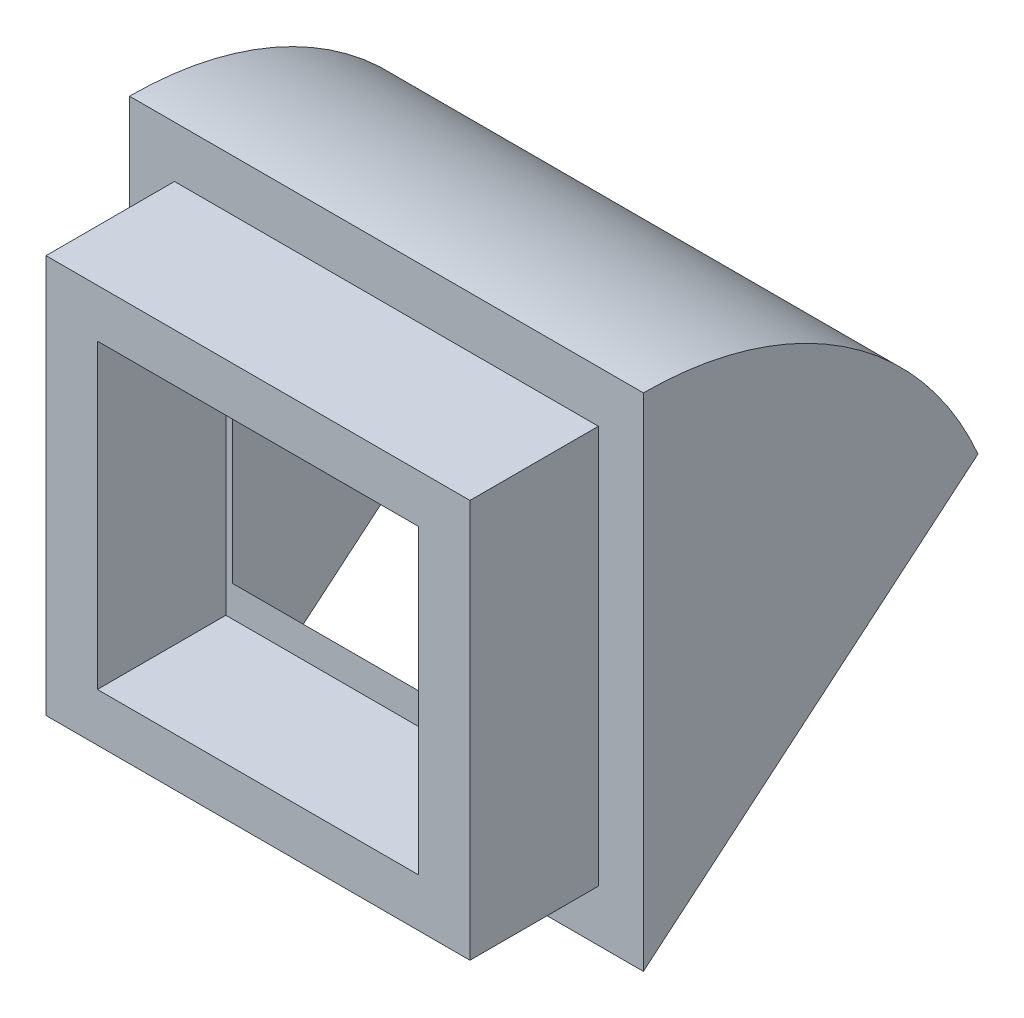
ISO-10303-21;
HEADER;
FILE_DESCRIPTION(('STEP AP214'),'2;1');
FILE_NAME('part.step','',(''),(''),'','','');
FILE_SCHEMA(('AUTOMOTIVE_DESIGN { 1 0 10303 214 1 1 1 1 }'));
ENDSEC;
DATA;
#1=APPLICATION_CONTEXT('core data for automotive mechanical design processes');
#2=APPLICATION_PROTOCOL_DEFINITION('international standard','automotive_design',2000,#1);
#3=PRODUCT_CONTEXT('',#1,'mechanical');
#4=PRODUCT('Part','Part','',(#3));
#5=PRODUCT_RELATED_PRODUCT_CATEGORY('part','',(#4));
#6=PRODUCT_DEFINITION_FORMATION('','',#4);
#7=PRODUCT_DEFINITION_CONTEXT('part definition',#1,'design');
#8=PRODUCT_DEFINITION('design','',#6,#7);
#9=PRODUCT_DEFINITION_SHAPE('','',#8);
#10=(LENGTH_UNIT() NAMED_UNIT(*) SI_UNIT(.MILLI.,.METRE.));
#11=(NAMED_UNIT(*) PLANE_ANGLE_UNIT() SI_UNIT($,.RADIAN.));
#12=(NAMED_UNIT(*) SI_UNIT($,.STERADIAN.) SOLID_ANGLE_UNIT());
#13=UNCERTAINTY_MEASURE_WITH_UNIT(LENGTH_MEASURE(1.E-05),#10,'distance_accuracy_value','');
#14=(GEOMETRIC_REPRESENTATION_CONTEXT(3) GLOBAL_UNCERTAINTY_ASSIGNED_CONTEXT((#13)) GLOBAL_UNIT_ASSIGNED_CONTEXT((#10,
#11,#12)) REPRESENTATION_CONTEXT('',''));
#15=CARTESIAN_POINT('',(0.,0.,0.));
#16=DIRECTION('',(0.,0.,1.));
#17=DIRECTION('',(1.,0.,0.));
#18=AXIS2_PLACEMENT_3D('',#15,#16,#17);
#19=CARTESIAN_POINT('',(10.,1.17738936467124,-13.0227555330226));
#20=DIRECTION('',(0.,0.766044443118975,0.642787609686544));
#21=DIRECTION('',(0.,-0.642787609686544,0.766044443118975));
#22=AXIS2_PLACEMENT_3D('',#19,#20,#21);
#23=PLANE('',#22);
#24=DIRECTION('',(0.,0.642787609686544,-0.766044443118975));
#25=VECTOR('',#24,1.);
#26=CARTESIAN_POINT('',(-10.,1.17738936467124,-13.0227555330226));
#27=LINE('',#26,#25);
#28=CARTESIAN_POINT('',(-10.,-9.75,0.));
#29=VERTEX_POINT('',#28);
#30=CARTESIAN_POINT('',(-10.,1.17738936467124,-13.0227555330226));
#31=VERTEX_POINT('',#30);
#32=EDGE_CURVE('E191',#29,#31,#27,.T.);
#33=ORIENTED_EDGE('',*,*,#32,.T.);
#34=DIRECTION('',(-1.,0.,0.));
#35=VECTOR('',#34,1.);
#36=CARTESIAN_POINT('',(10.,1.17738936467124,-13.0227555330226));
#37=LINE('',#36,#35);
#38=CARTESIAN_POINT('',(10.,1.17738936467124,-13.0227555330226));
#39=VERTEX_POINT('',#38);
#40=EDGE_CURVE('E197',#39,#31,#37,.T.);
#41=ORIENTED_EDGE('',*,*,#40,.F.);
#42=DIRECTION('',(0.,0.642787609686544,-0.766044443118975));
#43=VECTOR('',#42,1.);
#44=CARTESIAN_POINT('',(10.,1.17738936467124,-13.0227555330226));
#45=LINE('',#44,#43);
#46=CARTESIAN_POINT('',(10.,-9.75,0.));
#47=VERTEX_POINT('',#46);
#48=EDGE_CURVE('E194',#47,#39,#45,.T.);
#49=ORIENTED_EDGE('',*,*,#48,.F.);
#50=DIRECTION('',(-1.,0.,0.));
#51=VECTOR('',#50,1.);
#52=CARTESIAN_POINT('',(10.,-9.75,0.));
#53=LINE('',#52,#51);
#54=EDGE_CURVE('E211',#47,#29,#53,.T.);
#55=ORIENTED_EDGE('',*,*,#54,.T.);
#56=EDGE_LOOP('',(#33,#41,#49,#55));
#57=FACE_BOUND('',#56,.T.);
#58=DIRECTION('',(0.,-0.642787609686544,0.766044443118975));
#59=VECTOR('',#58,1.);
#60=CARTESIAN_POINT('',(-6.,-7.64989769518585,-2.50280446657761));
#61=LINE('',#60,#59);
#62=CARTESIAN_POINT('',(-6.,-3.79317203706659,-7.09907112529146));
#63=VERTEX_POINT('',#62);
#64=CARTESIAN_POINT('',(-6.,-7.64989769518585,-2.50280446657761));
#65=VERTEX_POINT('',#64);
#66=EDGE_CURVE('E146',#63,#65,#61,.T.);
#67=ORIENTED_EDGE('',*,*,#66,.T.);
#68=DIRECTION('',(1.,0.,0.));
#69=VECTOR('',#68,1.);
#70=CARTESIAN_POINT('',(-6.,-7.64989769518585,-2.50280446657761));
#71=LINE('',#70,#69);
#72=CARTESIAN_POINT('',(6.,-7.64989769518586,-2.50280446657761));
#73=VERTEX_POINT('',#72);
#74=EDGE_CURVE('E172',#65,#73,#71,.T.);
#75=ORIENTED_EDGE('',*,*,#74,.T.);
#76=DIRECTION('',(0.,0.642787609686544,-0.766044443118975));
#77=VECTOR('',#76,1.);
#78=CARTESIAN_POINT('',(6.,-7.64989769518585,-2.50280446657761));
#79=LINE('',#78,#77);
#80=CARTESIAN_POINT('',(6.,-3.79317203706659,-7.09907112529146));
#81=VERTEX_POINT('',#80);
#82=EDGE_CURVE('E168',#73,#81,#79,.T.);
#83=ORIENTED_EDGE('',*,*,#82,.T.);
#84=DIRECTION('',(-1.,0.,0.));
#85=VECTOR('',#84,1.);
#86=CARTESIAN_POINT('',(-6.,-3.79317203706659,-7.09907112529146));
#87=LINE('',#86,#85);
#88=EDGE_CURVE('E156',#81,#63,#87,.T.);
#89=ORIENTED_EDGE('',*,*,#88,.T.);
#90=EDGE_LOOP('',(#67,#75,#83,#89));
#91=FACE_BOUND('',#90,.T.);
#92=ADVANCED_FACE('F39',(#57,#91),#23,.F.);
#93=CARTESIAN_POINT('',(0.,0.,5.));
#94=DIRECTION('',(0.,0.,1.));
#95=DIRECTION('',(1.,0.,0.));
#96=AXIS2_PLACEMENT_3D('',#93,#94,#95);
#97=PLANE('',#96);
#98=DIRECTION('',(0.,1.,0.));
#99=VECTOR('',#98,1.);
#100=CARTESIAN_POINT('',(8.25,7.75,5.));
#101=LINE('',#100,#99);
#102=CARTESIAN_POINT('',(8.25,-7.75,5.));
#103=VERTEX_POINT('',#102);
#104=CARTESIAN_POINT('',(8.25,7.75,5.));
#105=VERTEX_POINT('',#104);
#106=EDGE_CURVE('E262',#103,#105,#101,.T.);
#107=ORIENTED_EDGE('',*,*,#106,.T.);
#108=DIRECTION('',(-1.,0.,0.));
#109=VECTOR('',#108,1.);
#110=CARTESIAN_POINT('',(-8.25,7.75,5.));
#111=LINE('',#110,#109);
#112=CARTESIAN_POINT('',(-8.25,7.75,5.));
#113=VERTEX_POINT('',#112);
#114=EDGE_CURVE('E266',#105,#113,#111,.T.);
#115=ORIENTED_EDGE('',*,*,#114,.T.);
#116=DIRECTION('',(0.,-1.,0.));
#117=VECTOR('',#116,1.);
#118=CARTESIAN_POINT('',(-8.25,7.75,5.));
#119=LINE('',#118,#117);
#120=CARTESIAN_POINT('',(-8.25,-7.75,5.));
#121=VERTEX_POINT('',#120);
#122=EDGE_CURVE('E270',#113,#121,#119,.T.);
#123=ORIENTED_EDGE('',*,*,#122,.T.);
#124=DIRECTION('',(1.,0.,0.));
#125=VECTOR('',#124,1.);
#126=CARTESIAN_POINT('',(-8.25,-7.75,5.));
#127=LINE('',#126,#125);
#128=EDGE_CURVE('E273',#121,#103,#127,.T.);
#129=ORIENTED_EDGE('',*,*,#128,.T.);
#130=EDGE_LOOP('',(#107,#115,#123,#129));
#131=FACE_BOUND('',#130,.T.);
#132=DIRECTION('',(-1.,0.,0.));
#133=VECTOR('',#132,1.);
#134=CARTESIAN_POINT('',(-6.25,5.87121212121212,5.));
#135=LINE('',#134,#133);
#136=CARTESIAN_POINT('',(6.25,5.87121212121212,5.));
#137=VERTEX_POINT('',#136);
#138=CARTESIAN_POINT('',(-6.25,5.87121212121212,5.));
#139=VERTEX_POINT('',#138);
#140=EDGE_CURVE('E223',#137,#139,#135,.T.);
#141=ORIENTED_EDGE('',*,*,#140,.F.);
#142=DIRECTION('',(0.,1.,0.));
#143=VECTOR('',#142,1.);
#144=CARTESIAN_POINT('',(6.25,5.87121212121212,5.));
#145=LINE('',#144,#143);
#146=CARTESIAN_POINT('',(6.25,-5.87121212121213,5.));
#147=VERTEX_POINT('',#146);
#148=EDGE_CURVE('E220',#147,#137,#145,.T.);
#149=ORIENTED_EDGE('',*,*,#148,.F.);
#150=DIRECTION('',(1.,0.,0.));
#151=VECTOR('',#150,1.);
#152=CARTESIAN_POINT('',(-6.25,-5.87121212121213,5.));
#153=LINE('',#152,#151);
#154=CARTESIAN_POINT('',(-6.25,-5.87121212121213,5.));
#155=VERTEX_POINT('',#154);
#156=EDGE_CURVE('E231',#155,#147,#153,.T.);
#157=ORIENTED_EDGE('',*,*,#156,.F.);
#158=DIRECTION('',(0.,-1.,0.));
#159=VECTOR('',#158,1.);
#160=CARTESIAN_POINT('',(-6.25,5.87121212121212,5.));
#161=LINE('',#160,#159);
#162=EDGE_CURVE('E227',#139,#155,#161,.T.);
#163=ORIENTED_EDGE('',*,*,#162,.F.);
#164=EDGE_LOOP('',(#141,#149,#157,#163));
#165=FACE_BOUND('',#164,.T.);
#166=ADVANCED_FACE('F317',(#131,#165),#97,.T.);
#167=CARTESIAN_POINT('',(8.25,7.75,5.));
#168=DIRECTION('',(-1.,0.,0.));
#169=DIRECTION('',(0.,-1.,0.));
#170=AXIS2_PLACEMENT_3D('',#167,#168,#169);
#171=PLANE('',#170);
#172=DIRECTION('',(0.,1.,0.));
#173=VECTOR('',#172,1.);
#174=CARTESIAN_POINT('',(8.25,7.75,0.));
#175=LINE('',#174,#173);
#176=CARTESIAN_POINT('',(8.25,-7.75,0.));
#177=VERTEX_POINT('',#176);
#178=CARTESIAN_POINT('',(8.25,7.75,0.));
#179=VERTEX_POINT('',#178);
#180=EDGE_CURVE('E261',#177,#179,#175,.T.);
#181=ORIENTED_EDGE('',*,*,#180,.T.);
#182=DIRECTION('',(0.,0.,-1.));
#183=VECTOR('',#182,1.);
#184=CARTESIAN_POINT('',(8.25,7.75,5.));
#185=LINE('',#184,#183);
#186=EDGE_CURVE('E11',#105,#179,#185,.T.);
#187=ORIENTED_EDGE('',*,*,#186,.F.);
#188=ORIENTED_EDGE('',*,*,#106,.F.);
#189=DIRECTION('',(0.,0.,-1.));
#190=VECTOR('',#189,1.);
#191=CARTESIAN_POINT('',(8.25,-7.75,5.));
#192=LINE('',#191,#190);
#193=EDGE_CURVE('E276',#103,#177,#192,.T.);
#194=ORIENTED_EDGE('',*,*,#193,.T.);
#195=EDGE_LOOP('',(#181,#187,#188,#194));
#196=FACE_BOUND('',#195,.T.);
#197=ADVANCED_FACE('F41',(#196),#171,.F.);
#198=CARTESIAN_POINT('',(-8.25,7.75,5.));
#199=DIRECTION('',(0.,-1.,0.));
#200=DIRECTION('',(0.,0.,-1.));
#201=AXIS2_PLACEMENT_3D('',#198,#199,#200);
#202=PLANE('',#201);
#203=DIRECTION('',(-1.,0.,0.));
#204=VECTOR('',#203,1.);
#205=CARTESIAN_POINT('',(-8.25,7.75,0.));
#206=LINE('',#205,#204);
#207=CARTESIAN_POINT('',(-8.25,7.75,0.));
#208=VERTEX_POINT('',#207);
#209=EDGE_CURVE('E280',#179,#208,#206,.T.);
#210=ORIENTED_EDGE('',*,*,#209,.T.);
#211=DIRECTION('',(0.,0.,-1.));
#212=VECTOR('',#211,1.);
#213=CARTESIAN_POINT('',(-8.25,7.75,5.));
#214=LINE('',#213,#212);
#215=EDGE_CURVE('E48',#113,#208,#214,.T.);
#216=ORIENTED_EDGE('',*,*,#215,.F.);
#217=ORIENTED_EDGE('',*,*,#114,.F.);
#218=ORIENTED_EDGE('',*,*,#186,.T.);
#219=EDGE_LOOP('',(#210,#216,#217,#218));
#220=FACE_BOUND('',#219,.T.);
#221=ADVANCED_FACE('F305',(#220),#202,.F.);
#222=CARTESIAN_POINT('',(-8.25,7.75,5.));
#223=DIRECTION('',(1.,0.,0.));
#224=DIRECTION('',(0.,1.,0.));
#225=AXIS2_PLACEMENT_3D('',#222,#223,#224);
#226=PLANE('',#225);
#227=DIRECTION('',(0.,-1.,0.));
#228=VECTOR('',#227,1.);
#229=CARTESIAN_POINT('',(-8.25,7.75,0.));
#230=LINE('',#229,#228);
#231=CARTESIAN_POINT('',(-8.25,-7.75,0.));
#232=VERTEX_POINT('',#231);
#233=EDGE_CURVE('E284',#208,#232,#230,.T.);
#234=ORIENTED_EDGE('',*,*,#233,.T.);
#235=DIRECTION('',(0.,0.,-1.));
#236=VECTOR('',#235,1.);
#237=CARTESIAN_POINT('',(-8.25,-7.75,5.));
#238=LINE('',#237,#236);
#239=EDGE_CURVE('E294',#121,#232,#238,.T.);
#240=ORIENTED_EDGE('',*,*,#239,.F.);
#241=ORIENTED_EDGE('',*,*,#122,.F.);
#242=ORIENTED_EDGE('',*,*,#215,.T.);
#243=EDGE_LOOP('',(#234,#240,#241,#242));
#244=FACE_BOUND('',#243,.T.);
#245=ADVANCED_FACE('F302',(#244),#226,.F.);
#246=CARTESIAN_POINT('',(-8.25,-7.75,5.));
#247=DIRECTION('',(0.,1.,0.));
#248=DIRECTION('',(0.,0.,1.));
#249=AXIS2_PLACEMENT_3D('',#246,#247,#248);
#250=PLANE('',#249);
#251=DIRECTION('',(1.,0.,0.));
#252=VECTOR('',#251,1.);
#253=CARTESIAN_POINT('',(-8.25,-7.75,0.));
#254=LINE('',#253,#252);
#255=EDGE_CURVE('E267',#232,#177,#254,.T.);
#256=ORIENTED_EDGE('',*,*,#255,.T.);
#257=ORIENTED_EDGE('',*,*,#193,.F.);
#258=ORIENTED_EDGE('',*,*,#128,.F.);
#259=ORIENTED_EDGE('',*,*,#239,.T.);
#260=EDGE_LOOP('',(#256,#257,#258,#259));
#261=FACE_BOUND('',#260,.T.);
#262=ADVANCED_FACE('F312',(#261),#250,.F.);
#263=CARTESIAN_POINT('',(6.25,5.87121212121212,5.));
#264=DIRECTION('',(-1.,0.,0.));
#265=DIRECTION('',(0.,0.,1.));
#266=AXIS2_PLACEMENT_3D('',#263,#264,#265);
#267=PLANE('',#266);
#268=DIRECTION('',(0.,1.,0.));
#269=VECTOR('',#268,1.);
#270=CARTESIAN_POINT('',(6.25,5.87121212121212,0.));
#271=LINE('',#270,#269);
#272=CARTESIAN_POINT('',(6.25,-5.87121212121213,0.));
#273=VERTEX_POINT('',#272);
#274=CARTESIAN_POINT('',(6.25,5.87121212121212,0.));
#275=VERTEX_POINT('',#274);
#276=EDGE_CURVE('E219',#273,#275,#271,.T.);
#277=ORIENTED_EDGE('',*,*,#276,.F.);
#278=DIRECTION('',(0.,0.,-1.));
#279=VECTOR('',#278,1.);
#280=CARTESIAN_POINT('',(6.25,-5.87121212121213,5.));
#281=LINE('',#280,#279);
#282=EDGE_CURVE('E234',#147,#273,#281,.T.);
#283=ORIENTED_EDGE('',*,*,#282,.F.);
#284=ORIENTED_EDGE('',*,*,#148,.T.);
#285=DIRECTION('',(0.,0.,-1.));
#286=VECTOR('',#285,1.);
#287=CARTESIAN_POINT('',(6.25,5.87121212121212,5.));
#288=LINE('',#287,#286);
#289=EDGE_CURVE('E257',#137,#275,#288,.T.);
#290=ORIENTED_EDGE('',*,*,#289,.T.);
#291=EDGE_LOOP('',(#277,#283,#284,#290));
#292=FACE_BOUND('',#291,.T.);
#293=ADVANCED_FACE('F337',(#292),#267,.T.);
#294=CARTESIAN_POINT('',(-6.25,5.87121212121212,5.));
#295=DIRECTION('',(0.,-1.,0.));
#296=DIRECTION('',(0.,0.,-1.));
#297=AXIS2_PLACEMENT_3D('',#294,#295,#296);
#298=PLANE('',#297);
#299=DIRECTION('',(-1.,0.,0.));
#300=VECTOR('',#299,1.);
#301=CARTESIAN_POINT('',(-6.25,5.87121212121212,0.));
#302=LINE('',#301,#300);
#303=CARTESIAN_POINT('',(-6.25,5.87121212121212,0.));
#304=VERTEX_POINT('',#303);
#305=EDGE_CURVE('E238',#275,#304,#302,.T.);
#306=ORIENTED_EDGE('',*,*,#305,.F.);
#307=ORIENTED_EDGE('',*,*,#289,.F.);
#308=ORIENTED_EDGE('',*,*,#140,.T.);
#309=DIRECTION('',(0.,0.,-1.));
#310=VECTOR('',#309,1.);
#311=CARTESIAN_POINT('',(-6.25,5.87121212121212,5.));
#312=LINE('',#311,#310);
#313=EDGE_CURVE('E254',#139,#304,#312,.T.);
#314=ORIENTED_EDGE('',*,*,#313,.T.);
#315=EDGE_LOOP('',(#306,#307,#308,#314));
#316=FACE_BOUND('',#315,.T.);
#317=ADVANCED_FACE('F328',(#316),#298,.T.);
#318=CARTESIAN_POINT('',(-6.25,5.87121212121212,5.));
#319=DIRECTION('',(1.,0.,0.));
#320=DIRECTION('',(0.,0.,-1.));
#321=AXIS2_PLACEMENT_3D('',#318,#319,#320);
#322=PLANE('',#321);
#323=DIRECTION('',(0.,-1.,0.));
#324=VECTOR('',#323,1.);
#325=CARTESIAN_POINT('',(-6.25,5.87121212121212,0.));
#326=LINE('',#325,#324);
#327=CARTESIAN_POINT('',(-6.25,-5.87121212121213,0.));
#328=VERTEX_POINT('',#327);
#329=EDGE_CURVE('E242',#304,#328,#326,.T.);
#330=ORIENTED_EDGE('',*,*,#329,.F.);
#331=ORIENTED_EDGE('',*,*,#313,.F.);
#332=ORIENTED_EDGE('',*,*,#162,.T.);
#333=DIRECTION('',(0.,0.,-1.));
#334=VECTOR('',#333,1.);
#335=CARTESIAN_POINT('',(-6.25,-5.87121212121213,5.));
#336=LINE('',#335,#334);
#337=EDGE_CURVE('E251',#155,#328,#336,.T.);
#338=ORIENTED_EDGE('',*,*,#337,.T.);
#339=EDGE_LOOP('',(#330,#331,#332,#338));
#340=FACE_BOUND('',#339,.T.);
#341=ADVANCED_FACE('F331',(#340),#322,.T.);
#342=CARTESIAN_POINT('',(-6.25,-5.87121212121213,5.));
#343=DIRECTION('',(0.,1.,0.));
#344=DIRECTION('',(0.,0.,1.));
#345=AXIS2_PLACEMENT_3D('',#342,#343,#344);
#346=PLANE('',#345);
#347=DIRECTION('',(1.,0.,0.));
#348=VECTOR('',#347,1.);
#349=CARTESIAN_POINT('',(-6.25,-5.87121212121213,0.));
#350=LINE('',#349,#348);
#351=EDGE_CURVE('E224',#328,#273,#350,.T.);
#352=ORIENTED_EDGE('',*,*,#351,.F.);
#353=ORIENTED_EDGE('',*,*,#337,.F.);
#354=ORIENTED_EDGE('',*,*,#156,.T.);
#355=ORIENTED_EDGE('',*,*,#282,.T.);
#356=EDGE_LOOP('',(#352,#353,#354,#355));
#357=FACE_BOUND('',#356,.T.);
#358=ADVANCED_FACE('F340',(#357),#346,.T.);
#359=CARTESIAN_POINT('',(10.,-9.75,0.));
#360=DIRECTION('',(0.,0.,-1.));
#361=DIRECTION('',(-1.,0.,0.));
#362=AXIS2_PLACEMENT_3D('',#359,#360,#361);
#363=PLANE('',#362);
#364=DIRECTION('',(1.,0.,0.));
#365=VECTOR('',#364,1.);
#366=CARTESIAN_POINT('',(-6.,4.66717148058123,0.));
#367=LINE('',#366,#365);
#368=CARTESIAN_POINT('',(-6.,4.66717148058123,0.));
#369=VERTEX_POINT('',#368);
#370=CARTESIAN_POINT('',(6.,4.66717148058123,0.));
#371=VERTEX_POINT('',#370);
#372=EDGE_CURVE('E163',#369,#371,#367,.T.);
#373=ORIENTED_EDGE('',*,*,#372,.T.);
#374=DIRECTION('',(0.,-1.,0.));
#375=VECTOR('',#374,1.);
#376=CARTESIAN_POINT('',(6.,-8.41594213830483,0.));
#377=LINE('',#376,#375);
#378=CARTESIAN_POINT('',(6.,-4.66717148058118,0.));
#379=VERTEX_POINT('',#378);
#380=EDGE_CURVE('E507',#371,#379,#377,.T.);
#381=ORIENTED_EDGE('',*,*,#380,.T.);
#382=DIRECTION('',(-1.,0.,0.));
#383=VECTOR('',#382,1.);
#384=CARTESIAN_POINT('',(-6.,-4.66717148058118,0.));
#385=LINE('',#384,#383);
#386=CARTESIAN_POINT('',(-6.,-4.66717148058118,0.));
#387=VERTEX_POINT('',#386);
#388=EDGE_CURVE('E203',#379,#387,#385,.T.);
#389=ORIENTED_EDGE('',*,*,#388,.T.);
#390=DIRECTION('',(0.,1.,0.));
#391=VECTOR('',#390,1.);
#392=CARTESIAN_POINT('',(-6.,-8.41594213830483,0.));
#393=LINE('',#392,#391);
#394=EDGE_CURVE('E155',#387,#369,#393,.T.);
#395=ORIENTED_EDGE('',*,*,#394,.T.);
#396=EDGE_LOOP('',(#373,#381,#389,#395));
#397=FACE_BOUND('',#396,.T.);
#398=ORIENTED_EDGE('',*,*,#351,.T.);
#399=ORIENTED_EDGE('',*,*,#276,.T.);
#400=ORIENTED_EDGE('',*,*,#305,.T.);
#401=ORIENTED_EDGE('',*,*,#329,.T.);
#402=EDGE_LOOP('',(#398,#399,#400,#401));
#403=FACE_BOUND('',#402,.T.);
#404=ADVANCED_FACE('F334',(#397,#403),#363,.F.);
#405=CARTESIAN_POINT('',(10.,-4.43708897848889,0.0061033528761887));
#406=DIRECTION('',(-1.,0.,0.));
#407=DIRECTION('',(0.,0.,1.));
#408=AXIS2_PLACEMENT_3D('',#405,#406,#407);
#409=CYLINDRICAL_SURFACE('',#408,14.1870902913345);
#410=CARTESIAN_POINT('',(-10.,-4.43708897848889,0.0061033528761887));
#411=DIRECTION('',(1.,0.,0.));
#412=DIRECTION('',(0.,0.,1.));
#413=AXIS2_PLACEMENT_3D('',#410,#411,#412);
#414=CIRCLE('',#413,14.1870902913345);
#415=CARTESIAN_POINT('',(-10.,9.75,0.));
#416=VERTEX_POINT('',#415);
#417=EDGE_CURVE('E198',#31,#416,#414,.T.);
#418=ORIENTED_EDGE('',*,*,#417,.T.);
#419=DIRECTION('',(-1.,0.,0.));
#420=VECTOR('',#419,1.);
#421=CARTESIAN_POINT('',(10.,9.75,0.));
#422=LINE('',#421,#420);
#423=CARTESIAN_POINT('',(10.,9.75,0.));
#424=VERTEX_POINT('',#423);
#425=EDGE_CURVE('E215',#424,#416,#422,.T.);
#426=ORIENTED_EDGE('',*,*,#425,.F.);
#427=CARTESIAN_POINT('',(10.,-4.43708897848889,0.0061033528761887));
#428=DIRECTION('',(1.,0.,0.));
#429=DIRECTION('',(0.,0.,1.));
#430=AXIS2_PLACEMENT_3D('',#427,#428,#429);
#431=CIRCLE('',#430,14.1870902913345);
#432=EDGE_CURVE('E186',#39,#424,#431,.T.);
#433=ORIENTED_EDGE('',*,*,#432,.F.);
#434=ORIENTED_EDGE('',*,*,#40,.T.);
#435=EDGE_LOOP('',(#418,#426,#433,#434));
#436=FACE_BOUND('',#435,.T.);
#437=ADVANCED_FACE('F347',(#436),#409,.T.);
#438=ORIENTED_EDGE('',*,*,#180,.F.);
#439=ORIENTED_EDGE('',*,*,#255,.F.);
#440=ORIENTED_EDGE('',*,*,#233,.F.);
#441=ORIENTED_EDGE('',*,*,#209,.F.);
#442=EDGE_LOOP('',(#438,#439,#440,#441));
#443=FACE_BOUND('',#442,.T.);
#444=DIRECTION('',(0.,-1.,0.));
#445=VECTOR('',#444,1.);
#446=CARTESIAN_POINT('',(-10.,-9.75,0.));
#447=LINE('',#446,#445);
#448=EDGE_CURVE('E202',#416,#29,#447,.T.);
#449=ORIENTED_EDGE('',*,*,#448,.T.);
#450=ORIENTED_EDGE('',*,*,#54,.F.);
#451=DIRECTION('',(0.,-1.,0.));
#452=VECTOR('',#451,1.);
#453=CARTESIAN_POINT('',(10.,-9.75,0.));
#454=LINE('',#453,#452);
#455=EDGE_CURVE('E190',#424,#47,#454,.T.);
#456=ORIENTED_EDGE('',*,*,#455,.F.);
#457=ORIENTED_EDGE('',*,*,#425,.T.);
#458=EDGE_LOOP('',(#449,#450,#456,#457));
#459=FACE_BOUND('',#458,.T.);
#460=ADVANCED_FACE('F308',(#443,#459),#363,.F.);
#461=CARTESIAN_POINT('',(10.,-4.43708897848889,0.0061033528761887));
#462=DIRECTION('',(-1.,0.,0.));
#463=DIRECTION('',(0.,0.,1.));
#464=AXIS2_PLACEMENT_3D('',#461,#462,#463);
#465=PLANE('',#464);
#466=ORIENTED_EDGE('',*,*,#432,.T.);
#467=ORIENTED_EDGE('',*,*,#455,.T.);
#468=ORIENTED_EDGE('',*,*,#48,.T.);
#469=EDGE_LOOP('',(#466,#467,#468));
#470=FACE_BOUND('',#469,.T.);
#471=ADVANCED_FACE('F361',(#470),#465,.F.);
#472=CARTESIAN_POINT('',(-10.,-4.43708897848889,0.0061033528761887));
#473=DIRECTION('',(-1.,0.,0.));
#474=DIRECTION('',(0.,0.,1.));
#475=AXIS2_PLACEMENT_3D('',#472,#473,#474);
#476=PLANE('',#475);
#477=ORIENTED_EDGE('',*,*,#417,.F.);
#478=ORIENTED_EDGE('',*,*,#32,.F.);
#479=ORIENTED_EDGE('',*,*,#448,.F.);
#480=EDGE_LOOP('',(#477,#478,#479));
#481=FACE_BOUND('',#480,.T.);
#482=ADVANCED_FACE('F358',(#481),#476,.T.);
#483=CARTESIAN_POINT('',(-6.,-8.41594213830483,-3.14559207626416));
#484=DIRECTION('',(1.,0.,0.));
#485=DIRECTION('',(0.,0.,-1.));
#486=AXIS2_PLACEMENT_3D('',#483,#484,#485);
#487=PLANE('',#486);
#488=DIRECTION('',(0.,0.766044443118974,0.642787609686544));
#489=VECTOR('',#488,1.);
#490=CARTESIAN_POINT('',(-6.,-8.41594213830483,-3.14559207626416));
#491=LINE('',#490,#489);
#492=EDGE_CURVE('E55',#65,#387,#491,.T.);
#493=ORIENTED_EDGE('',*,*,#492,.F.);
#494=ORIENTED_EDGE('',*,*,#66,.F.);
#495=DIRECTION('',(0.,0.766044443118974,0.642787609686544));
#496=VECTOR('',#495,1.);
#497=CARTESIAN_POINT('',(-6.,-4.55921648018557,-7.74185873497801));
#498=LINE('',#497,#496);
#499=EDGE_CURVE('E149',#63,#369,#498,.T.);
#500=ORIENTED_EDGE('',*,*,#499,.T.);
#501=ORIENTED_EDGE('',*,*,#394,.F.);
#502=EDGE_LOOP('',(#493,#494,#500,#501));
#503=FACE_BOUND('',#502,.T.);
#504=ADVANCED_FACE('F148',(#503),#487,.T.);
#505=CARTESIAN_POINT('',(-6.,-4.55921648018557,-7.74185873497801));
#506=DIRECTION('',(0.,-0.642787609686544,0.766044443118974));
#507=DIRECTION('',(0.,-0.766044443118974,-0.642787609686544));
#508=AXIS2_PLACEMENT_3D('',#505,#506,#507);
#509=PLANE('',#508);
#510=ORIENTED_EDGE('',*,*,#499,.F.);
#511=ORIENTED_EDGE('',*,*,#88,.F.);
#512=DIRECTION('',(0.,0.766044443118974,0.642787609686544));
#513=VECTOR('',#512,1.);
#514=CARTESIAN_POINT('',(6.,-4.55921648018557,-7.74185873497801));
#515=LINE('',#514,#513);
#516=EDGE_CURVE('E165',#81,#371,#515,.T.);
#517=ORIENTED_EDGE('',*,*,#516,.T.);
#518=ORIENTED_EDGE('',*,*,#372,.F.);
#519=EDGE_LOOP('',(#510,#511,#517,#518));
#520=FACE_BOUND('',#519,.T.);
#521=ADVANCED_FACE('F159',(#520),#509,.T.);
#522=CARTESIAN_POINT('',(6.,-8.41594213830483,-3.14559207626416));
#523=DIRECTION('',(-1.,0.,0.));
#524=DIRECTION('',(0.,0.,1.));
#525=AXIS2_PLACEMENT_3D('',#522,#523,#524);
#526=PLANE('',#525);
#527=ORIENTED_EDGE('',*,*,#516,.F.);
#528=ORIENTED_EDGE('',*,*,#82,.F.);
#529=DIRECTION('',(0.,0.766044443118974,0.642787609686544));
#530=VECTOR('',#529,1.);
#531=CARTESIAN_POINT('',(6.,-8.41594213830483,-3.14559207626416));
#532=LINE('',#531,#530);
#533=EDGE_CURVE('E60',#73,#379,#532,.T.);
#534=ORIENTED_EDGE('',*,*,#533,.T.);
#535=ORIENTED_EDGE('',*,*,#380,.F.);
#536=EDGE_LOOP('',(#527,#528,#534,#535));
#537=FACE_BOUND('',#536,.T.);
#538=ADVANCED_FACE('F383',(#537),#526,.T.);
#539=CARTESIAN_POINT('',(-6.,-8.41594213830483,-3.14559207626416));
#540=DIRECTION('',(0.,0.642787609686544,-0.766044443118974));
#541=DIRECTION('',(0.,0.766044443118974,0.642787609686544));
#542=AXIS2_PLACEMENT_3D('',#539,#540,#541);
#543=PLANE('',#542);
#544=ORIENTED_EDGE('',*,*,#533,.F.);
#545=ORIENTED_EDGE('',*,*,#74,.F.);
#546=ORIENTED_EDGE('',*,*,#492,.T.);
#547=ORIENTED_EDGE('',*,*,#388,.F.);
#548=EDGE_LOOP('',(#544,#545,#546,#547));
#549=FACE_BOUND('',#548,.T.);
#550=ADVANCED_FACE('F380',(#549),#543,.T.);
#551=CLOSED_SHELL('',(#92,#166,#197,#221,#245,#262,#293,#317,#341,#358,#404,#437,#460,#471,#482,
#504,#521,#538,#550));
#552=MANIFOLD_SOLID_BREP('B2',#551);
#553=ADVANCED_BREP_SHAPE_REPRESENTATION('',(#18,#552),#14);
#554=SHAPE_DEFINITION_REPRESENTATION(#9,#553);
ENDSEC;
END-ISO-10303-21;
